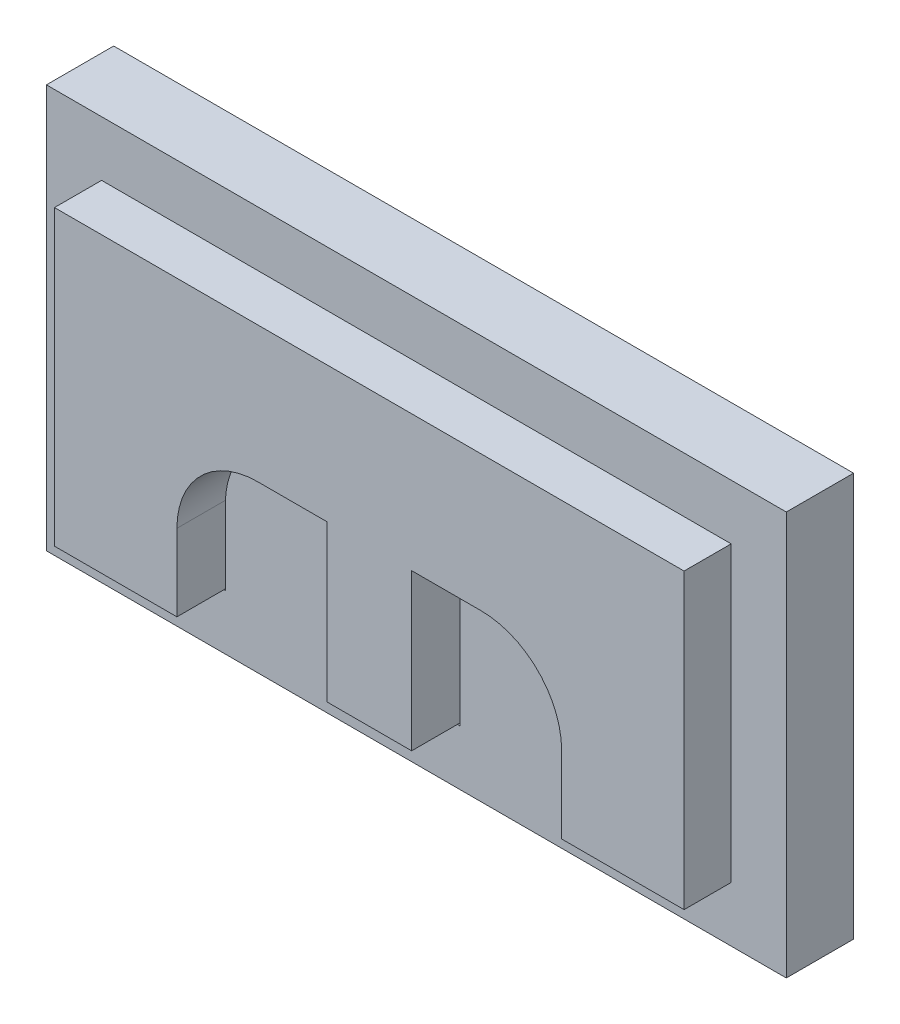
ISO-10303-21;
HEADER;
FILE_DESCRIPTION(('STEP AP214'),'2;1');
FILE_NAME('part.step','',(''),(''),'','','');
FILE_SCHEMA(('AUTOMOTIVE_DESIGN { 1 0 10303 214 1 1 1 1 }'));
ENDSEC;
DATA;
#1=APPLICATION_CONTEXT('core data for automotive mechanical design processes');
#2=APPLICATION_PROTOCOL_DEFINITION('international standard','automotive_design',2000,#1);
#3=PRODUCT_CONTEXT('',#1,'mechanical');
#4=PRODUCT('Part','Part','',(#3));
#5=PRODUCT_RELATED_PRODUCT_CATEGORY('part','',(#4));
#6=PRODUCT_DEFINITION_FORMATION('','',#4);
#7=PRODUCT_DEFINITION_CONTEXT('part definition',#1,'design');
#8=PRODUCT_DEFINITION('design','',#6,#7);
#9=PRODUCT_DEFINITION_SHAPE('','',#8);
#10=(LENGTH_UNIT() NAMED_UNIT(*) SI_UNIT(.MILLI.,.METRE.));
#11=(NAMED_UNIT(*) PLANE_ANGLE_UNIT() SI_UNIT($,.RADIAN.));
#12=(NAMED_UNIT(*) SI_UNIT($,.STERADIAN.) SOLID_ANGLE_UNIT());
#13=UNCERTAINTY_MEASURE_WITH_UNIT(LENGTH_MEASURE(1.E-05),#10,'distance_accuracy_value','');
#14=(GEOMETRIC_REPRESENTATION_CONTEXT(3) GLOBAL_UNCERTAINTY_ASSIGNED_CONTEXT((#13)) GLOBAL_UNIT_ASSIGNED_CONTEXT((#10,
#11,#12)) REPRESENTATION_CONTEXT('',''));
#15=CARTESIAN_POINT('',(0.,0.,0.));
#16=DIRECTION('',(0.,0.,1.));
#17=DIRECTION('',(1.,0.,0.));
#18=AXIS2_PLACEMENT_3D('',#15,#16,#17);
#19=CARTESIAN_POINT('',(0.,0.,10.));
#20=DIRECTION('',(0.,0.,-1.));
#21=DIRECTION('',(-1.,0.,0.));
#22=AXIS2_PLACEMENT_3D('',#19,#20,#21);
#23=PLANE('',#22);
#24=DIRECTION('',(0.,-1.,0.));
#25=VECTOR('',#24,1.);
#26=CARTESIAN_POINT('',(0.,0.,10.));
#27=LINE('',#26,#25);
#28=CARTESIAN_POINT('',(0.,60.,10.));
#29=VERTEX_POINT('',#28);
#30=CARTESIAN_POINT('',(0.,0.,10.));
#31=VERTEX_POINT('',#30);
#32=EDGE_CURVE('E417',#29,#31,#27,.T.);
#33=ORIENTED_EDGE('',*,*,#32,.T.);
#34=DIRECTION('',(1.,0.,0.));
#35=VECTOR('',#34,1.);
#36=CARTESIAN_POINT('',(0.,0.,10.));
#37=LINE('',#36,#35);
#38=CARTESIAN_POINT('',(110.,0.,10.));
#39=VERTEX_POINT('',#38);
#40=EDGE_CURVE('E420',#31,#39,#37,.T.);
#41=ORIENTED_EDGE('',*,*,#40,.T.);
#42=DIRECTION('',(0.,1.,0.));
#43=VECTOR('',#42,1.);
#44=CARTESIAN_POINT('',(110.,0.,10.));
#45=LINE('',#44,#43);
#46=CARTESIAN_POINT('',(110.,60.,10.));
#47=VERTEX_POINT('',#46);
#48=EDGE_CURVE('E423',#39,#47,#45,.T.);
#49=ORIENTED_EDGE('',*,*,#48,.T.);
#50=DIRECTION('',(-1.,0.,0.));
#51=VECTOR('',#50,1.);
#52=CARTESIAN_POINT('',(0.,60.,10.));
#53=LINE('',#52,#51);
#54=EDGE_CURVE('E425',#47,#29,#53,.T.);
#55=ORIENTED_EDGE('',*,*,#54,.T.);
#56=EDGE_LOOP('',(#33,#41,#49,#55));
#57=FACE_BOUND('',#56,.T.);
#58=DIRECTION('',(1.,0.,0.));
#59=VECTOR('',#58,1.);
#60=CARTESIAN_POINT('',(0.,31.4,10.));
#61=LINE('',#60,#59);
#62=CARTESIAN_POINT('',(38.6,31.4,10.));
#63=VERTEX_POINT('',#62);
#64=CARTESIAN_POINT('',(48.5,31.4,10.));
#65=VERTEX_POINT('',#64);
#66=EDGE_CURVE('E250',#63,#65,#61,.T.);
#67=ORIENTED_EDGE('',*,*,#66,.F.);
#68=CARTESIAN_POINT('',(38.6,19.4,10.));
#69=DIRECTION('',(0.,0.,-1.));
#70=DIRECTION('',(-1.,0.,0.));
#71=AXIS2_PLACEMENT_3D('',#68,#69,#70);
#72=CIRCLE('',#71,12.);
#73=CARTESIAN_POINT('',(26.6,19.4,10.));
#74=VERTEX_POINT('',#73);
#75=EDGE_CURVE('E11',#74,#63,#72,.T.);
#76=ORIENTED_EDGE('',*,*,#75,.F.);
#77=DIRECTION('',(0.,1.,0.));
#78=VECTOR('',#77,1.);
#79=CARTESIAN_POINT('',(26.6,0.,10.));
#80=LINE('',#79,#78);
#81=CARTESIAN_POINT('',(26.6,8.2,10.));
#82=VERTEX_POINT('',#81);
#83=EDGE_CURVE('E49',#82,#74,#80,.T.);
#84=ORIENTED_EDGE('',*,*,#83,.F.);
#85=DIRECTION('',(-1.,0.,0.));
#86=VECTOR('',#85,1.);
#87=CARTESIAN_POINT('',(0.,8.2,10.));
#88=LINE('',#87,#86);
#89=CARTESIAN_POINT('',(26.4,8.2,10.));
#90=VERTEX_POINT('',#89);
#91=EDGE_CURVE('E296',#82,#90,#88,.T.);
#92=ORIENTED_EDGE('',*,*,#91,.T.);
#93=DIRECTION('',(1.,0.,0.));
#94=VECTOR('',#93,1.);
#95=CARTESIAN_POINT('',(8.2,8.2,10.));
#96=LINE('',#95,#94);
#97=CARTESIAN_POINT('',(8.2,8.2,10.));
#98=VERTEX_POINT('',#97);
#99=EDGE_CURVE('E396',#98,#90,#96,.T.);
#100=ORIENTED_EDGE('',*,*,#99,.F.);
#101=DIRECTION('',(0.,-1.,0.));
#102=VECTOR('',#101,1.);
#103=CARTESIAN_POINT('',(8.2,51.8,10.));
#104=LINE('',#103,#102);
#105=CARTESIAN_POINT('',(8.2,51.8,10.));
#106=VERTEX_POINT('',#105);
#107=EDGE_CURVE('E379',#106,#98,#104,.T.);
#108=ORIENTED_EDGE('',*,*,#107,.F.);
#109=DIRECTION('',(-1.,0.,0.));
#110=VECTOR('',#109,1.);
#111=CARTESIAN_POINT('',(8.2,51.8,10.));
#112=LINE('',#111,#110);
#113=CARTESIAN_POINT('',(101.8,51.8,10.));
#114=VERTEX_POINT('',#113);
#115=EDGE_CURVE('E384',#114,#106,#112,.T.);
#116=ORIENTED_EDGE('',*,*,#115,.F.);
#117=DIRECTION('',(0.,1.,0.));
#118=VECTOR('',#117,1.);
#119=CARTESIAN_POINT('',(101.8,51.8,10.));
#120=LINE('',#119,#118);
#121=CARTESIAN_POINT('',(101.8,8.2,10.));
#122=VERTEX_POINT('',#121);
#123=EDGE_CURVE('E399',#122,#114,#120,.T.);
#124=ORIENTED_EDGE('',*,*,#123,.F.);
#125=CARTESIAN_POINT('',(83.6,8.2,10.));
#126=VERTEX_POINT('',#125);
#127=EDGE_CURVE('E395',#126,#122,#96,.T.);
#128=ORIENTED_EDGE('',*,*,#127,.F.);
#129=DIRECTION('',(1.,0.,0.));
#130=VECTOR('',#129,1.);
#131=CARTESIAN_POINT('',(0.,8.2,10.));
#132=LINE('',#131,#130);
#133=CARTESIAN_POINT('',(83.4,8.2,10.));
#134=VERTEX_POINT('',#133);
#135=EDGE_CURVE('E358',#134,#126,#132,.T.);
#136=ORIENTED_EDGE('',*,*,#135,.F.);
#137=DIRECTION('',(0.,1.,0.));
#138=VECTOR('',#137,1.);
#139=CARTESIAN_POINT('',(83.4,1.03339955640333E-13,10.));
#140=LINE('',#139,#138);
#141=CARTESIAN_POINT('',(83.4,19.4,10.));
#142=VERTEX_POINT('',#141);
#143=EDGE_CURVE('E461',#134,#142,#140,.T.);
#144=ORIENTED_EDGE('',*,*,#143,.T.);
#145=CARTESIAN_POINT('',(71.4,19.4,10.));
#146=DIRECTION('',(0.,0.,-1.));
#147=DIRECTION('',(-1.,0.,0.));
#148=AXIS2_PLACEMENT_3D('',#145,#146,#147);
#149=CIRCLE('',#148,12.);
#150=CARTESIAN_POINT('',(71.4,31.4,10.));
#151=VERTEX_POINT('',#150);
#152=EDGE_CURVE('E458',#142,#151,#149,.F.);
#153=ORIENTED_EDGE('',*,*,#152,.T.);
#154=DIRECTION('',(-1.,0.,0.));
#155=VECTOR('',#154,1.);
#156=CARTESIAN_POINT('',(0.,31.4,10.));
#157=LINE('',#156,#155);
#158=CARTESIAN_POINT('',(61.5,31.4,10.));
#159=VERTEX_POINT('',#158);
#160=EDGE_CURVE('E336',#151,#159,#157,.T.);
#161=ORIENTED_EDGE('',*,*,#160,.T.);
#162=DIRECTION('',(0.,1.,0.));
#163=VECTOR('',#162,1.);
#164=CARTESIAN_POINT('',(61.5,31.6,10.));
#165=LINE('',#164,#163);
#166=CARTESIAN_POINT('',(61.5,8.2,10.));
#167=VERTEX_POINT('',#166);
#168=EDGE_CURVE('E361',#167,#159,#165,.T.);
#169=ORIENTED_EDGE('',*,*,#168,.F.);
#170=CARTESIAN_POINT('',(48.5,8.2,10.));
#171=VERTEX_POINT('',#170);
#172=EDGE_CURVE('E400',#171,#167,#96,.T.);
#173=ORIENTED_EDGE('',*,*,#172,.F.);
#174=DIRECTION('',(0.,1.,0.));
#175=VECTOR('',#174,1.);
#176=CARTESIAN_POINT('',(48.5,31.6,10.));
#177=LINE('',#176,#175);
#178=EDGE_CURVE('E370',#171,#65,#177,.T.);
#179=ORIENTED_EDGE('',*,*,#178,.T.);
#180=EDGE_LOOP('',(#67,#76,#84,#92,#100,#108,#116,#124,#128,#136,#144,#153,#161,#169,#173,#179));
#181=FACE_BOUND('',#180,.T.);
#182=ADVANCED_FACE('F41',(#57,#181),#23,.F.);
#183=CARTESIAN_POINT('',(8.2,8.2,17.));
#184=DIRECTION('',(0.,1.,0.));
#185=DIRECTION('',(0.,0.,1.));
#186=AXIS2_PLACEMENT_3D('',#183,#184,#185);
#187=PLANE('',#186);
#188=DIRECTION('',(0.,0.,1.));
#189=VECTOR('',#188,1.);
#190=CARTESIAN_POINT('',(83.6,8.2,10.));
#191=LINE('',#190,#189);
#192=CARTESIAN_POINT('',(83.6,8.2,17.));
#193=VERTEX_POINT('',#192);
#194=EDGE_CURVE('E363',#126,#193,#191,.T.);
#195=ORIENTED_EDGE('',*,*,#194,.F.);
#196=ORIENTED_EDGE('',*,*,#127,.T.);
#197=DIRECTION('',(0.,0.,-1.));
#198=VECTOR('',#197,1.);
#199=CARTESIAN_POINT('',(101.8,8.2,17.));
#200=LINE('',#199,#198);
#201=CARTESIAN_POINT('',(101.8,8.2,17.));
#202=VERTEX_POINT('',#201);
#203=EDGE_CURVE('E410',#202,#122,#200,.T.);
#204=ORIENTED_EDGE('',*,*,#203,.F.);
#205=DIRECTION('',(1.,0.,0.));
#206=VECTOR('',#205,1.);
#207=CARTESIAN_POINT('',(8.2,8.2,17.));
#208=LINE('',#207,#206);
#209=EDGE_CURVE('E383',#193,#202,#208,.T.);
#210=ORIENTED_EDGE('',*,*,#209,.F.);
#211=EDGE_LOOP('',(#195,#196,#204,#210));
#212=FACE_BOUND('',#211,.T.);
#213=ADVANCED_FACE('F499',(#212),#187,.F.);
#214=CARTESIAN_POINT('',(0.,0.,17.));
#215=DIRECTION('',(0.,0.,1.));
#216=DIRECTION('',(1.,0.,0.));
#217=AXIS2_PLACEMENT_3D('',#214,#215,#216);
#218=PLANE('',#217);
#219=DIRECTION('',(-1.,0.,0.));
#220=VECTOR('',#219,1.);
#221=CARTESIAN_POINT('',(26.4,31.6,17.));
#222=LINE('',#221,#220);
#223=CARTESIAN_POINT('',(48.7,31.6,17.));
#224=VERTEX_POINT('',#223);
#225=CARTESIAN_POINT('',(38.4,31.6,17.));
#226=VERTEX_POINT('',#225);
#227=EDGE_CURVE('E373',#224,#226,#222,.T.);
#228=ORIENTED_EDGE('',*,*,#227,.F.);
#229=DIRECTION('',(0.,-1.,0.));
#230=VECTOR('',#229,1.);
#231=CARTESIAN_POINT('',(48.7,0.,17.));
#232=LINE('',#231,#230);
#233=CARTESIAN_POINT('',(48.7,8.4,17.));
#234=VERTEX_POINT('',#233);
#235=EDGE_CURVE('E256',#224,#234,#232,.T.);
#236=ORIENTED_EDGE('',*,*,#235,.T.);
#237=DIRECTION('',(-1.,0.,0.));
#238=VECTOR('',#237,1.);
#239=CARTESIAN_POINT('',(0.,8.39999999999998,17.));
#240=LINE('',#239,#238);
#241=CARTESIAN_POINT('',(61.3,8.4,17.));
#242=VERTEX_POINT('',#241);
#243=EDGE_CURVE('E303',#242,#234,#240,.T.);
#244=ORIENTED_EDGE('',*,*,#243,.F.);
#245=DIRECTION('',(0.,-1.,0.));
#246=VECTOR('',#245,1.);
#247=CARTESIAN_POINT('',(61.3,0.,17.));
#248=LINE('',#247,#246);
#249=CARTESIAN_POINT('',(61.3,31.6,17.));
#250=VERTEX_POINT('',#249);
#251=EDGE_CURVE('E299',#250,#242,#248,.T.);
#252=ORIENTED_EDGE('',*,*,#251,.F.);
#253=DIRECTION('',(1.,0.,0.));
#254=VECTOR('',#253,1.);
#255=CARTESIAN_POINT('',(83.6,31.6,17.));
#256=LINE('',#255,#254);
#257=CARTESIAN_POINT('',(71.6,31.6,17.));
#258=VERTEX_POINT('',#257);
#259=EDGE_CURVE('E364',#250,#258,#256,.T.);
#260=ORIENTED_EDGE('',*,*,#259,.T.);
#261=CARTESIAN_POINT('',(71.6,19.6,17.));
#262=DIRECTION('',(0.,0.,1.));
#263=DIRECTION('',(1.,0.,0.));
#264=AXIS2_PLACEMENT_3D('',#261,#262,#263);
#265=CIRCLE('',#264,12.);
#266=CARTESIAN_POINT('',(83.6,19.6,17.));
#267=VERTEX_POINT('',#266);
#268=EDGE_CURVE('E56',#258,#267,#265,.F.);
#269=ORIENTED_EDGE('',*,*,#268,.T.);
#270=DIRECTION('',(0.,-1.,0.));
#271=VECTOR('',#270,1.);
#272=CARTESIAN_POINT('',(83.6,31.6,17.));
#273=LINE('',#272,#271);
#274=EDGE_CURVE('E360',#267,#193,#273,.T.);
#275=ORIENTED_EDGE('',*,*,#274,.T.);
#276=ORIENTED_EDGE('',*,*,#209,.T.);
#277=DIRECTION('',(0.,1.,0.));
#278=VECTOR('',#277,1.);
#279=CARTESIAN_POINT('',(101.8,51.8,17.));
#280=LINE('',#279,#278);
#281=CARTESIAN_POINT('',(101.8,51.8,17.));
#282=VERTEX_POINT('',#281);
#283=EDGE_CURVE('E388',#202,#282,#280,.T.);
#284=ORIENTED_EDGE('',*,*,#283,.T.);
#285=DIRECTION('',(-1.,0.,0.));
#286=VECTOR('',#285,1.);
#287=CARTESIAN_POINT('',(8.2,51.8,17.));
#288=LINE('',#287,#286);
#289=CARTESIAN_POINT('',(8.2,51.8,17.));
#290=VERTEX_POINT('',#289);
#291=EDGE_CURVE('E390',#282,#290,#288,.T.);
#292=ORIENTED_EDGE('',*,*,#291,.T.);
#293=DIRECTION('',(0.,-1.,0.));
#294=VECTOR('',#293,1.);
#295=CARTESIAN_POINT('',(8.2,51.8,17.));
#296=LINE('',#295,#294);
#297=CARTESIAN_POINT('',(8.2,8.2,17.));
#298=VERTEX_POINT('',#297);
#299=EDGE_CURVE('E380',#290,#298,#296,.T.);
#300=ORIENTED_EDGE('',*,*,#299,.T.);
#301=CARTESIAN_POINT('',(26.4,8.2,17.));
#302=VERTEX_POINT('',#301);
#303=EDGE_CURVE('E385',#298,#302,#208,.T.);
#304=ORIENTED_EDGE('',*,*,#303,.T.);
#305=DIRECTION('',(0.,-1.,0.));
#306=VECTOR('',#305,1.);
#307=CARTESIAN_POINT('',(26.4,31.6,17.));
#308=LINE('',#307,#306);
#309=CARTESIAN_POINT('',(26.4,19.6,17.));
#310=VERTEX_POINT('',#309);
#311=EDGE_CURVE('E369',#310,#302,#308,.T.);
#312=ORIENTED_EDGE('',*,*,#311,.F.);
#313=CARTESIAN_POINT('',(38.4,19.6,17.));
#314=DIRECTION('',(0.,0.,1.));
#315=DIRECTION('',(1.,0.,0.));
#316=AXIS2_PLACEMENT_3D('',#313,#314,#315);
#317=CIRCLE('',#316,12.);
#318=EDGE_CURVE('E451',#310,#226,#317,.F.);
#319=ORIENTED_EDGE('',*,*,#318,.T.);
#320=EDGE_LOOP('',(#228,#236,#244,#252,#260,#269,#275,#276,#284,#292,#300,#304,#312,#319));
#321=FACE_BOUND('',#320,.T.);
#322=ADVANCED_FACE('F514',(#321),#218,.T.);
#323=ORIENTED_EDGE('',*,*,#99,.T.);
#324=DIRECTION('',(0.,0.,1.));
#325=VECTOR('',#324,1.);
#326=CARTESIAN_POINT('',(26.4,8.2,10.));
#327=LINE('',#326,#325);
#328=EDGE_CURVE('E372',#90,#302,#327,.T.);
#329=ORIENTED_EDGE('',*,*,#328,.T.);
#330=ORIENTED_EDGE('',*,*,#303,.F.);
#331=DIRECTION('',(0.,0.,-1.));
#332=VECTOR('',#331,1.);
#333=CARTESIAN_POINT('',(8.2,8.2,17.));
#334=LINE('',#333,#332);
#335=EDGE_CURVE('E413',#298,#98,#334,.T.);
#336=ORIENTED_EDGE('',*,*,#335,.T.);
#337=EDGE_LOOP('',(#323,#329,#330,#336));
#338=FACE_BOUND('',#337,.T.);
#339=ADVANCED_FACE('F540',(#338),#187,.F.);
#340=CARTESIAN_POINT('',(0.,0.,10.));
#341=DIRECTION('',(1.,0.,0.));
#342=DIRECTION('',(0.,0.,-1.));
#343=AXIS2_PLACEMENT_3D('',#340,#341,#342);
#344=PLANE('',#343);
#345=DIRECTION('',(0.,-1.,0.));
#346=VECTOR('',#345,1.);
#347=CARTESIAN_POINT('',(0.,0.,0.));
#348=LINE('',#347,#346);
#349=CARTESIAN_POINT('',(0.,60.,0.));
#350=VERTEX_POINT('',#349);
#351=CARTESIAN_POINT('',(0.,0.,0.));
#352=VERTEX_POINT('',#351);
#353=EDGE_CURVE('E416',#350,#352,#348,.T.);
#354=ORIENTED_EDGE('',*,*,#353,.T.);
#355=DIRECTION('',(0.,0.,-1.));
#356=VECTOR('',#355,1.);
#357=CARTESIAN_POINT('',(0.,0.,10.));
#358=LINE('',#357,#356);
#359=EDGE_CURVE('E443',#31,#352,#358,.T.);
#360=ORIENTED_EDGE('',*,*,#359,.F.);
#361=ORIENTED_EDGE('',*,*,#32,.F.);
#362=DIRECTION('',(0.,0.,-1.));
#363=VECTOR('',#362,1.);
#364=CARTESIAN_POINT('',(0.,60.,10.));
#365=LINE('',#364,#363);
#366=EDGE_CURVE('E427',#29,#350,#365,.T.);
#367=ORIENTED_EDGE('',*,*,#366,.T.);
#368=EDGE_LOOP('',(#354,#360,#361,#367));
#369=FACE_BOUND('',#368,.T.);
#370=ADVANCED_FACE('F584',(#369),#344,.F.);
#371=CARTESIAN_POINT('',(0.,0.,10.));
#372=DIRECTION('',(0.,1.,0.));
#373=DIRECTION('',(0.,0.,1.));
#374=AXIS2_PLACEMENT_3D('',#371,#372,#373);
#375=PLANE('',#374);
#376=DIRECTION('',(1.,0.,0.));
#377=VECTOR('',#376,1.);
#378=CARTESIAN_POINT('',(0.,0.,0.));
#379=LINE('',#378,#377);
#380=CARTESIAN_POINT('',(110.,0.,0.));
#381=VERTEX_POINT('',#380);
#382=EDGE_CURVE('E430',#352,#381,#379,.T.);
#383=ORIENTED_EDGE('',*,*,#382,.T.);
#384=DIRECTION('',(0.,0.,-1.));
#385=VECTOR('',#384,1.);
#386=CARTESIAN_POINT('',(110.,0.,10.));
#387=LINE('',#386,#385);
#388=EDGE_CURVE('E440',#39,#381,#387,.T.);
#389=ORIENTED_EDGE('',*,*,#388,.F.);
#390=ORIENTED_EDGE('',*,*,#40,.F.);
#391=ORIENTED_EDGE('',*,*,#359,.T.);
#392=EDGE_LOOP('',(#383,#389,#390,#391));
#393=FACE_BOUND('',#392,.T.);
#394=ADVANCED_FACE('F580',(#393),#375,.F.);
#395=CARTESIAN_POINT('',(110.,0.,10.));
#396=DIRECTION('',(-1.,0.,0.));
#397=DIRECTION('',(0.,0.,1.));
#398=AXIS2_PLACEMENT_3D('',#395,#396,#397);
#399=PLANE('',#398);
#400=DIRECTION('',(0.,1.,0.));
#401=VECTOR('',#400,1.);
#402=CARTESIAN_POINT('',(110.,0.,0.));
#403=LINE('',#402,#401);
#404=CARTESIAN_POINT('',(110.,60.,0.));
#405=VERTEX_POINT('',#404);
#406=EDGE_CURVE('E432',#381,#405,#403,.T.);
#407=ORIENTED_EDGE('',*,*,#406,.T.);
#408=DIRECTION('',(0.,0.,-1.));
#409=VECTOR('',#408,1.);
#410=CARTESIAN_POINT('',(110.,60.,10.));
#411=LINE('',#410,#409);
#412=EDGE_CURVE('E437',#47,#405,#411,.T.);
#413=ORIENTED_EDGE('',*,*,#412,.F.);
#414=ORIENTED_EDGE('',*,*,#48,.F.);
#415=ORIENTED_EDGE('',*,*,#388,.T.);
#416=EDGE_LOOP('',(#407,#413,#414,#415));
#417=FACE_BOUND('',#416,.T.);
#418=ADVANCED_FACE('F576',(#417),#399,.F.);
#419=CARTESIAN_POINT('',(0.,60.,10.));
#420=DIRECTION('',(0.,-1.,0.));
#421=DIRECTION('',(0.,0.,-1.));
#422=AXIS2_PLACEMENT_3D('',#419,#420,#421);
#423=PLANE('',#422);
#424=DIRECTION('',(-1.,0.,0.));
#425=VECTOR('',#424,1.);
#426=CARTESIAN_POINT('',(0.,60.,0.));
#427=LINE('',#426,#425);
#428=EDGE_CURVE('E421',#405,#350,#427,.T.);
#429=ORIENTED_EDGE('',*,*,#428,.T.);
#430=ORIENTED_EDGE('',*,*,#366,.F.);
#431=ORIENTED_EDGE('',*,*,#54,.F.);
#432=ORIENTED_EDGE('',*,*,#412,.T.);
#433=EDGE_LOOP('',(#429,#430,#431,#432));
#434=FACE_BOUND('',#433,.T.);
#435=ADVANCED_FACE('F572',(#434),#423,.F.);
#436=CARTESIAN_POINT('',(0.,0.,0.));
#437=DIRECTION('',(0.,0.,-1.));
#438=DIRECTION('',(-1.,0.,0.));
#439=AXIS2_PLACEMENT_3D('',#436,#437,#438);
#440=PLANE('',#439);
#441=ORIENTED_EDGE('',*,*,#353,.F.);
#442=ORIENTED_EDGE('',*,*,#428,.F.);
#443=ORIENTED_EDGE('',*,*,#406,.F.);
#444=ORIENTED_EDGE('',*,*,#382,.F.);
#445=EDGE_LOOP('',(#441,#442,#443,#444));
#446=FACE_BOUND('',#445,.T.);
#447=ADVANCED_FACE('F558',(#446),#440,.T.);
#448=CARTESIAN_POINT('',(8.2,51.8,17.));
#449=DIRECTION('',(1.,0.,0.));
#450=DIRECTION('',(0.,1.,0.));
#451=AXIS2_PLACEMENT_3D('',#448,#449,#450);
#452=PLANE('',#451);
#453=ORIENTED_EDGE('',*,*,#107,.T.);
#454=ORIENTED_EDGE('',*,*,#335,.F.);
#455=ORIENTED_EDGE('',*,*,#299,.F.);
#456=DIRECTION('',(0.,0.,-1.));
#457=VECTOR('',#456,1.);
#458=CARTESIAN_POINT('',(8.2,51.8,17.));
#459=LINE('',#458,#457);
#460=EDGE_CURVE('E392',#290,#106,#459,.T.);
#461=ORIENTED_EDGE('',*,*,#460,.T.);
#462=EDGE_LOOP('',(#453,#454,#455,#461));
#463=FACE_BOUND('',#462,.T.);
#464=ADVANCED_FACE('F543',(#463),#452,.F.);
#465=CARTESIAN_POINT('',(101.8,51.8,17.));
#466=DIRECTION('',(-1.,0.,0.));
#467=DIRECTION('',(0.,0.,1.));
#468=AXIS2_PLACEMENT_3D('',#465,#466,#467);
#469=PLANE('',#468);
#470=ORIENTED_EDGE('',*,*,#123,.T.);
#471=DIRECTION('',(0.,0.,-1.));
#472=VECTOR('',#471,1.);
#473=CARTESIAN_POINT('',(101.8,51.8,17.));
#474=LINE('',#473,#472);
#475=EDGE_CURVE('E407',#282,#114,#474,.T.);
#476=ORIENTED_EDGE('',*,*,#475,.F.);
#477=ORIENTED_EDGE('',*,*,#283,.F.);
#478=ORIENTED_EDGE('',*,*,#203,.T.);
#479=EDGE_LOOP('',(#470,#476,#477,#478));
#480=FACE_BOUND('',#479,.T.);
#481=ADVANCED_FACE('F550',(#480),#469,.F.);
#482=CARTESIAN_POINT('',(8.2,51.8,17.));
#483=DIRECTION('',(0.,-1.,0.));
#484=DIRECTION('',(0.,0.,-1.));
#485=AXIS2_PLACEMENT_3D('',#482,#483,#484);
#486=PLANE('',#485);
#487=ORIENTED_EDGE('',*,*,#115,.T.);
#488=ORIENTED_EDGE('',*,*,#460,.F.);
#489=ORIENTED_EDGE('',*,*,#291,.F.);
#490=ORIENTED_EDGE('',*,*,#475,.T.);
#491=EDGE_LOOP('',(#487,#488,#489,#490));
#492=FACE_BOUND('',#491,.T.);
#493=ADVANCED_FACE('F547',(#492),#486,.F.);
#494=CARTESIAN_POINT('',(26.4,31.6,10.));
#495=DIRECTION('',(-1.,0.,0.));
#496=DIRECTION('',(0.,0.,1.));
#497=AXIS2_PLACEMENT_3D('',#494,#495,#496);
#498=PLANE('',#497);
#499=ORIENTED_EDGE('',*,*,#328,.F.);
#500=DIRECTION('',(0.,0.,1.));
#501=VECTOR('',#500,1.);
#502=CARTESIAN_POINT('',(26.4,8.2,7.));
#503=LINE('',#502,#501);
#504=CARTESIAN_POINT('',(26.4,8.2,7.));
#505=VERTEX_POINT('',#504);
#506=EDGE_CURVE('E286',#505,#90,#503,.T.);
#507=ORIENTED_EDGE('',*,*,#506,.F.);
#508=DIRECTION('',(0.,-1.,0.));
#509=VECTOR('',#508,1.);
#510=CARTESIAN_POINT('',(26.4,0.,7.));
#511=LINE('',#510,#509);
#512=CARTESIAN_POINT('',(26.4,19.6,7.));
#513=VERTEX_POINT('',#512);
#514=EDGE_CURVE('E269',#513,#505,#511,.T.);
#515=ORIENTED_EDGE('',*,*,#514,.F.);
#516=DIRECTION('',(0.,0.,1.));
#517=VECTOR('',#516,1.);
#518=CARTESIAN_POINT('',(26.4,19.6,17.));
#519=LINE('',#518,#517);
#520=EDGE_CURVE('E446',#513,#310,#519,.T.);
#521=ORIENTED_EDGE('',*,*,#520,.T.);
#522=ORIENTED_EDGE('',*,*,#311,.T.);
#523=EDGE_LOOP('',(#499,#507,#515,#521,#522));
#524=FACE_BOUND('',#523,.T.);
#525=ADVANCED_FACE('F534',(#524),#498,.F.);
#526=CARTESIAN_POINT('',(26.4,31.6,10.));
#527=DIRECTION('',(0.,1.,0.));
#528=DIRECTION('',(0.,0.,1.));
#529=AXIS2_PLACEMENT_3D('',#526,#527,#528);
#530=PLANE('',#529);
#531=DIRECTION('',(0.,0.,1.));
#532=VECTOR('',#531,1.);
#533=CARTESIAN_POINT('',(38.4,31.6,10.));
#534=LINE('',#533,#532);
#535=CARTESIAN_POINT('',(38.4,31.6,7.));
#536=VERTEX_POINT('',#535);
#537=EDGE_CURVE('E449',#226,#536,#534,.F.);
#538=ORIENTED_EDGE('',*,*,#537,.T.);
#539=DIRECTION('',(-1.,0.,0.));
#540=VECTOR('',#539,1.);
#541=CARTESIAN_POINT('',(110.,31.6,7.));
#542=LINE('',#541,#540);
#543=CARTESIAN_POINT('',(48.7,31.6,7.));
#544=VERTEX_POINT('',#543);
#545=EDGE_CURVE('E263',#544,#536,#542,.T.);
#546=ORIENTED_EDGE('',*,*,#545,.F.);
#547=DIRECTION('',(0.,0.,1.));
#548=VECTOR('',#547,1.);
#549=CARTESIAN_POINT('',(48.7,31.6,7.));
#550=LINE('',#549,#548);
#551=EDGE_CURVE('E288',#544,#224,#550,.T.);
#552=ORIENTED_EDGE('',*,*,#551,.T.);
#553=ORIENTED_EDGE('',*,*,#227,.T.);
#554=EDGE_LOOP('',(#538,#546,#552,#553));
#555=FACE_BOUND('',#554,.T.);
#556=ADVANCED_FACE('F525',(#555),#530,.F.);
#557=CARTESIAN_POINT('',(38.4,19.6,10.));
#558=DIRECTION('',(0.,0.,-1.));
#559=DIRECTION('',(-1.,0.,0.));
#560=AXIS2_PLACEMENT_3D('',#557,#558,#559);
#561=CYLINDRICAL_SURFACE('',#560,12.);
#562=ORIENTED_EDGE('',*,*,#520,.F.);
#563=CARTESIAN_POINT('',(38.4,19.6,7.));
#564=DIRECTION('',(0.,0.,-1.));
#565=DIRECTION('',(-1.,0.,0.));
#566=AXIS2_PLACEMENT_3D('',#563,#564,#565);
#567=CIRCLE('',#566,12.);
#568=EDGE_CURVE('E266',#536,#513,#567,.F.);
#569=ORIENTED_EDGE('',*,*,#568,.F.);
#570=ORIENTED_EDGE('',*,*,#537,.F.);
#571=ORIENTED_EDGE('',*,*,#318,.F.);
#572=EDGE_LOOP('',(#562,#569,#570,#571));
#573=FACE_BOUND('',#572,.T.);
#574=ADVANCED_FACE('F529',(#573),#561,.F.);
#575=CARTESIAN_POINT('',(83.6,31.6,10.));
#576=DIRECTION('',(-1.,0.,0.));
#577=DIRECTION('',(0.,0.,1.));
#578=AXIS2_PLACEMENT_3D('',#575,#576,#577);
#579=PLANE('',#578);
#580=ORIENTED_EDGE('',*,*,#274,.F.);
#581=DIRECTION('',(0.,0.,1.));
#582=VECTOR('',#581,1.);
#583=CARTESIAN_POINT('',(83.6,19.6,10.));
#584=LINE('',#583,#582);
#585=CARTESIAN_POINT('',(83.6,19.6,7.));
#586=VERTEX_POINT('',#585);
#587=EDGE_CURVE('E455',#267,#586,#584,.F.);
#588=ORIENTED_EDGE('',*,*,#587,.T.);
#589=DIRECTION('',(0.,-1.,0.));
#590=VECTOR('',#589,1.);
#591=CARTESIAN_POINT('',(83.6,0.,7.));
#592=LINE('',#591,#590);
#593=CARTESIAN_POINT('',(83.6,8.2,7.));
#594=VERTEX_POINT('',#593);
#595=EDGE_CURVE('E311',#586,#594,#592,.T.);
#596=ORIENTED_EDGE('',*,*,#595,.T.);
#597=DIRECTION('',(0.,0.,1.));
#598=VECTOR('',#597,1.);
#599=CARTESIAN_POINT('',(83.6,8.2,7.));
#600=LINE('',#599,#598);
#601=EDGE_CURVE('E345',#594,#126,#600,.T.);
#602=ORIENTED_EDGE('',*,*,#601,.T.);
#603=ORIENTED_EDGE('',*,*,#194,.T.);
#604=EDGE_LOOP('',(#580,#588,#596,#602,#603));
#605=FACE_BOUND('',#604,.T.);
#606=ADVANCED_FACE('F503',(#605),#579,.T.);
#607=CARTESIAN_POINT('',(83.6,31.6,10.));
#608=DIRECTION('',(0.,-1.,0.));
#609=DIRECTION('',(0.,0.,-1.));
#610=AXIS2_PLACEMENT_3D('',#607,#608,#609);
#611=PLANE('',#610);
#612=DIRECTION('',(1.,0.,0.));
#613=VECTOR('',#612,1.);
#614=CARTESIAN_POINT('',(0.,31.6,7.));
#615=LINE('',#614,#613);
#616=CARTESIAN_POINT('',(61.3,31.6,7.));
#617=VERTEX_POINT('',#616);
#618=CARTESIAN_POINT('',(71.6,31.6,7.));
#619=VERTEX_POINT('',#618);
#620=EDGE_CURVE('E316',#617,#619,#615,.T.);
#621=ORIENTED_EDGE('',*,*,#620,.T.);
#622=DIRECTION('',(0.,0.,1.));
#623=VECTOR('',#622,1.);
#624=CARTESIAN_POINT('',(71.6,31.6,17.));
#625=LINE('',#624,#623);
#626=EDGE_CURVE('E453',#619,#258,#625,.T.);
#627=ORIENTED_EDGE('',*,*,#626,.T.);
#628=ORIENTED_EDGE('',*,*,#259,.F.);
#629=DIRECTION('',(0.,0.,1.));
#630=VECTOR('',#629,1.);
#631=CARTESIAN_POINT('',(61.3,31.6,7.));
#632=LINE('',#631,#630);
#633=EDGE_CURVE('E342',#617,#250,#632,.T.);
#634=ORIENTED_EDGE('',*,*,#633,.F.);
#635=EDGE_LOOP('',(#621,#627,#628,#634));
#636=FACE_BOUND('',#635,.T.);
#637=ADVANCED_FACE('F509',(#636),#611,.T.);
#638=CARTESIAN_POINT('',(71.6,19.6,10.));
#639=DIRECTION('',(0.,0.,-1.));
#640=DIRECTION('',(-1.,0.,0.));
#641=AXIS2_PLACEMENT_3D('',#638,#639,#640);
#642=CYLINDRICAL_SURFACE('',#641,12.);
#643=ORIENTED_EDGE('',*,*,#626,.F.);
#644=CARTESIAN_POINT('',(71.6,19.6,7.));
#645=DIRECTION('',(0.,0.,1.));
#646=DIRECTION('',(1.,0.,0.));
#647=AXIS2_PLACEMENT_3D('',#644,#645,#646);
#648=CIRCLE('',#647,12.);
#649=EDGE_CURVE('E313',#619,#586,#648,.F.);
#650=ORIENTED_EDGE('',*,*,#649,.T.);
#651=ORIENTED_EDGE('',*,*,#587,.F.);
#652=ORIENTED_EDGE('',*,*,#268,.F.);
#653=EDGE_LOOP('',(#643,#650,#651,#652));
#654=FACE_BOUND('',#653,.T.);
#655=ADVANCED_FACE('F43',(#654),#642,.F.);
#656=CARTESIAN_POINT('',(61.5,0.,7.));
#657=DIRECTION('',(1.,0.,0.));
#658=DIRECTION('',(0.,0.,-1.));
#659=AXIS2_PLACEMENT_3D('',#656,#657,#658);
#660=PLANE('',#659);
#661=DIRECTION('',(0.,0.,1.));
#662=VECTOR('',#661,1.);
#663=CARTESIAN_POINT('',(61.5,31.4,7.));
#664=LINE('',#663,#662);
#665=CARTESIAN_POINT('',(61.5,31.4,7.));
#666=VERTEX_POINT('',#665);
#667=EDGE_CURVE('E333',#666,#159,#664,.T.);
#668=ORIENTED_EDGE('',*,*,#667,.F.);
#669=DIRECTION('',(0.,1.,0.));
#670=VECTOR('',#669,1.);
#671=CARTESIAN_POINT('',(61.5,0.,7.));
#672=LINE('',#671,#670);
#673=CARTESIAN_POINT('',(61.5,8.2,7.));
#674=VERTEX_POINT('',#673);
#675=EDGE_CURVE('E326',#674,#666,#672,.T.);
#676=ORIENTED_EDGE('',*,*,#675,.F.);
#677=DIRECTION('',(0.,0.,1.));
#678=VECTOR('',#677,1.);
#679=CARTESIAN_POINT('',(61.5,8.2,7.));
#680=LINE('',#679,#678);
#681=EDGE_CURVE('E337',#674,#167,#680,.T.);
#682=ORIENTED_EDGE('',*,*,#681,.T.);
#683=ORIENTED_EDGE('',*,*,#168,.T.);
#684=EDGE_LOOP('',(#668,#676,#682,#683));
#685=FACE_BOUND('',#684,.T.);
#686=ADVANCED_FACE('F478',(#685),#660,.F.);
#687=CARTESIAN_POINT('',(83.4,1.03339955640333E-13,7.));
#688=DIRECTION('',(-1.,0.,0.));
#689=DIRECTION('',(0.,-1.,0.));
#690=AXIS2_PLACEMENT_3D('',#687,#688,#689);
#691=PLANE('',#690);
#692=DIRECTION('',(0.,0.,1.));
#693=VECTOR('',#692,1.);
#694=CARTESIAN_POINT('',(83.4,8.2,7.));
#695=LINE('',#694,#693);
#696=CARTESIAN_POINT('',(83.4,8.2,7.));
#697=VERTEX_POINT('',#696);
#698=EDGE_CURVE('E348',#697,#134,#695,.T.);
#699=ORIENTED_EDGE('',*,*,#698,.F.);
#700=DIRECTION('',(0.,-1.,0.));
#701=VECTOR('',#700,1.);
#702=CARTESIAN_POINT('',(83.4,1.03339955640333E-13,7.));
#703=LINE('',#702,#701);
#704=CARTESIAN_POINT('',(83.4,19.4,7.));
#705=VERTEX_POINT('',#704);
#706=EDGE_CURVE('E306',#705,#697,#703,.T.);
#707=ORIENTED_EDGE('',*,*,#706,.F.);
#708=DIRECTION('',(0.,0.,1.));
#709=VECTOR('',#708,1.);
#710=CARTESIAN_POINT('',(83.4,19.4,7.));
#711=LINE('',#710,#709);
#712=EDGE_CURVE('E351',#705,#142,#711,.T.);
#713=ORIENTED_EDGE('',*,*,#712,.T.);
#714=ORIENTED_EDGE('',*,*,#143,.F.);
#715=EDGE_LOOP('',(#699,#707,#713,#714));
#716=FACE_BOUND('',#715,.T.);
#717=ADVANCED_FACE('F489',(#716),#691,.F.);
#718=CARTESIAN_POINT('',(71.4,19.4,7.));
#719=DIRECTION('',(0.,0.,1.));
#720=DIRECTION('',(1.,0.,0.));
#721=AXIS2_PLACEMENT_3D('',#718,#719,#720);
#722=CYLINDRICAL_SURFACE('',#721,12.);
#723=ORIENTED_EDGE('',*,*,#712,.F.);
#724=CARTESIAN_POINT('',(71.4,19.4,7.));
#725=DIRECTION('',(0.,0.,1.));
#726=DIRECTION('',(1.,0.,0.));
#727=AXIS2_PLACEMENT_3D('',#724,#725,#726);
#728=CIRCLE('',#727,12.);
#729=CARTESIAN_POINT('',(71.4,31.4,7.));
#730=VERTEX_POINT('',#729);
#731=EDGE_CURVE('E302',#730,#705,#728,.F.);
#732=ORIENTED_EDGE('',*,*,#731,.F.);
#733=DIRECTION('',(0.,0.,1.));
#734=VECTOR('',#733,1.);
#735=CARTESIAN_POINT('',(71.4,31.4,7.));
#736=LINE('',#735,#734);
#737=EDGE_CURVE('E329',#730,#151,#736,.T.);
#738=ORIENTED_EDGE('',*,*,#737,.T.);
#739=ORIENTED_EDGE('',*,*,#152,.F.);
#740=EDGE_LOOP('',(#723,#732,#738,#739));
#741=FACE_BOUND('',#740,.T.);
#742=ADVANCED_FACE('F486',(#741),#722,.T.);
#743=CARTESIAN_POINT('',(0.,8.2,7.));
#744=DIRECTION('',(0.,1.,0.));
#745=DIRECTION('',(0.,0.,1.));
#746=AXIS2_PLACEMENT_3D('',#743,#744,#745);
#747=PLANE('',#746);
#748=ORIENTED_EDGE('',*,*,#135,.T.);
#749=ORIENTED_EDGE('',*,*,#601,.F.);
#750=DIRECTION('',(-1.,0.,0.));
#751=VECTOR('',#750,1.);
#752=CARTESIAN_POINT('',(0.,8.2,7.));
#753=LINE('',#752,#751);
#754=EDGE_CURVE('E309',#594,#697,#753,.T.);
#755=ORIENTED_EDGE('',*,*,#754,.T.);
#756=ORIENTED_EDGE('',*,*,#698,.T.);
#757=EDGE_LOOP('',(#748,#749,#755,#756));
#758=FACE_BOUND('',#757,.T.);
#759=ADVANCED_FACE('F492',(#758),#747,.T.);
#760=CARTESIAN_POINT('',(0.,31.4,7.));
#761=DIRECTION('',(0.,-1.,0.));
#762=DIRECTION('',(0.,0.,-1.));
#763=AXIS2_PLACEMENT_3D('',#760,#761,#762);
#764=PLANE('',#763);
#765=ORIENTED_EDGE('',*,*,#737,.F.);
#766=DIRECTION('',(1.,0.,0.));
#767=VECTOR('',#766,1.);
#768=CARTESIAN_POINT('',(0.,31.4,7.));
#769=LINE('',#768,#767);
#770=EDGE_CURVE('E300',#666,#730,#769,.T.);
#771=ORIENTED_EDGE('',*,*,#770,.F.);
#772=ORIENTED_EDGE('',*,*,#667,.T.);
#773=ORIENTED_EDGE('',*,*,#160,.F.);
#774=EDGE_LOOP('',(#765,#771,#772,#773));
#775=FACE_BOUND('',#774,.T.);
#776=ADVANCED_FACE('F481',(#775),#764,.F.);
#777=CARTESIAN_POINT('',(0.,8.2,7.));
#778=DIRECTION('',(0.,-1.,0.));
#779=DIRECTION('',(0.,0.,-1.));
#780=AXIS2_PLACEMENT_3D('',#777,#778,#779);
#781=PLANE('',#780);
#782=ORIENTED_EDGE('',*,*,#681,.F.);
#783=DIRECTION('',(1.,0.,0.));
#784=VECTOR('',#783,1.);
#785=CARTESIAN_POINT('',(0.,8.2,7.));
#786=LINE('',#785,#784);
#787=CARTESIAN_POINT('',(48.5,8.2,7.));
#788=VERTEX_POINT('',#787);
#789=EDGE_CURVE('E324',#788,#674,#786,.T.);
#790=ORIENTED_EDGE('',*,*,#789,.F.);
#791=DIRECTION('',(0.,0.,1.));
#792=VECTOR('',#791,1.);
#793=CARTESIAN_POINT('',(48.5,8.2,7.));
#794=LINE('',#793,#792);
#795=EDGE_CURVE('E237',#788,#171,#794,.T.);
#796=ORIENTED_EDGE('',*,*,#795,.T.);
#797=ORIENTED_EDGE('',*,*,#172,.T.);
#798=EDGE_LOOP('',(#782,#790,#796,#797));
#799=FACE_BOUND('',#798,.T.);
#800=ADVANCED_FACE('F475',(#799),#781,.F.);
#801=CARTESIAN_POINT('',(0.,8.39999999999998,7.));
#802=DIRECTION('',(0.,1.,0.));
#803=DIRECTION('',(-1.,0.,0.));
#804=AXIS2_PLACEMENT_3D('',#801,#802,#803);
#805=PLANE('',#804);
#806=ORIENTED_EDGE('',*,*,#243,.T.);
#807=DIRECTION('',(0.,0.,1.));
#808=VECTOR('',#807,1.);
#809=CARTESIAN_POINT('',(48.7,8.4,7.));
#810=LINE('',#809,#808);
#811=CARTESIAN_POINT('',(48.7,8.4,7.));
#812=VERTEX_POINT('',#811);
#813=EDGE_CURVE('E291',#812,#234,#810,.T.);
#814=ORIENTED_EDGE('',*,*,#813,.F.);
#815=DIRECTION('',(-1.,0.,0.));
#816=VECTOR('',#815,1.);
#817=CARTESIAN_POINT('',(0.,8.39999999999998,7.));
#818=LINE('',#817,#816);
#819=CARTESIAN_POINT('',(61.3,8.4,7.));
#820=VERTEX_POINT('',#819);
#821=EDGE_CURVE('E322',#820,#812,#818,.T.);
#822=ORIENTED_EDGE('',*,*,#821,.F.);
#823=DIRECTION('',(0.,0.,1.));
#824=VECTOR('',#823,1.);
#825=CARTESIAN_POINT('',(61.3,8.4,7.));
#826=LINE('',#825,#824);
#827=EDGE_CURVE('E340',#820,#242,#826,.T.);
#828=ORIENTED_EDGE('',*,*,#827,.T.);
#829=EDGE_LOOP('',(#806,#814,#822,#828));
#830=FACE_BOUND('',#829,.T.);
#831=ADVANCED_FACE('F518',(#830),#805,.F.);
#832=CARTESIAN_POINT('',(61.3,0.,7.));
#833=DIRECTION('',(-1.,0.,0.));
#834=DIRECTION('',(0.,0.,1.));
#835=AXIS2_PLACEMENT_3D('',#832,#833,#834);
#836=PLANE('',#835);
#837=ORIENTED_EDGE('',*,*,#251,.T.);
#838=ORIENTED_EDGE('',*,*,#827,.F.);
#839=DIRECTION('',(0.,-1.,0.));
#840=VECTOR('',#839,1.);
#841=CARTESIAN_POINT('',(61.3,0.,7.));
#842=LINE('',#841,#840);
#843=EDGE_CURVE('E319',#617,#820,#842,.T.);
#844=ORIENTED_EDGE('',*,*,#843,.F.);
#845=ORIENTED_EDGE('',*,*,#633,.T.);
#846=EDGE_LOOP('',(#837,#838,#844,#845));
#847=FACE_BOUND('',#846,.T.);
#848=ADVANCED_FACE('F512',(#847),#836,.F.);
#849=CARTESIAN_POINT('',(0.,0.,7.));
#850=DIRECTION('',(0.,0.,1.));
#851=DIRECTION('',(1.,0.,0.));
#852=AXIS2_PLACEMENT_3D('',#849,#850,#851);
#853=PLANE('',#852);
#854=ORIENTED_EDGE('',*,*,#770,.T.);
#855=ORIENTED_EDGE('',*,*,#731,.T.);
#856=ORIENTED_EDGE('',*,*,#706,.T.);
#857=ORIENTED_EDGE('',*,*,#754,.F.);
#858=ORIENTED_EDGE('',*,*,#595,.F.);
#859=ORIENTED_EDGE('',*,*,#649,.F.);
#860=ORIENTED_EDGE('',*,*,#620,.F.);
#861=ORIENTED_EDGE('',*,*,#843,.T.);
#862=ORIENTED_EDGE('',*,*,#821,.T.);
#863=DIRECTION('',(0.,-1.,0.));
#864=VECTOR('',#863,1.);
#865=CARTESIAN_POINT('',(48.7,0.,7.));
#866=LINE('',#865,#864);
#867=EDGE_CURVE('E241',#544,#812,#866,.T.);
#868=ORIENTED_EDGE('',*,*,#867,.F.);
#869=ORIENTED_EDGE('',*,*,#545,.T.);
#870=ORIENTED_EDGE('',*,*,#568,.T.);
#871=ORIENTED_EDGE('',*,*,#514,.T.);
#872=DIRECTION('',(1.,0.,0.));
#873=VECTOR('',#872,1.);
#874=CARTESIAN_POINT('',(110.,8.2,7.));
#875=LINE('',#874,#873);
#876=CARTESIAN_POINT('',(26.6,8.2,7.));
#877=VERTEX_POINT('',#876);
#878=EDGE_CURVE('E272',#505,#877,#875,.T.);
#879=ORIENTED_EDGE('',*,*,#878,.T.);
#880=DIRECTION('',(0.,-1.,0.));
#881=VECTOR('',#880,1.);
#882=CARTESIAN_POINT('',(26.6,1.03339955640333E-13,7.));
#883=LINE('',#882,#881);
#884=CARTESIAN_POINT('',(26.6,19.4,7.));
#885=VERTEX_POINT('',#884);
#886=EDGE_CURVE('E275',#885,#877,#883,.T.);
#887=ORIENTED_EDGE('',*,*,#886,.F.);
#888=CARTESIAN_POINT('',(38.6,19.4,7.));
#889=DIRECTION('',(0.,0.,-1.));
#890=DIRECTION('',(-1.,0.,0.));
#891=AXIS2_PLACEMENT_3D('',#888,#889,#890);
#892=CIRCLE('',#891,12.);
#893=CARTESIAN_POINT('',(38.6,31.4,7.));
#894=VERTEX_POINT('',#893);
#895=EDGE_CURVE('E251',#894,#885,#892,.F.);
#896=ORIENTED_EDGE('',*,*,#895,.F.);
#897=DIRECTION('',(-1.,0.,0.));
#898=VECTOR('',#897,1.);
#899=CARTESIAN_POINT('',(110.,31.4,7.));
#900=LINE('',#899,#898);
#901=CARTESIAN_POINT('',(48.5,31.4,7.));
#902=VERTEX_POINT('',#901);
#903=EDGE_CURVE('E242',#902,#894,#900,.T.);
#904=ORIENTED_EDGE('',*,*,#903,.F.);
#905=DIRECTION('',(0.,1.,0.));
#906=VECTOR('',#905,1.);
#907=CARTESIAN_POINT('',(48.5,0.,7.));
#908=LINE('',#907,#906);
#909=EDGE_CURVE('E231',#788,#902,#908,.T.);
#910=ORIENTED_EDGE('',*,*,#909,.F.);
#911=ORIENTED_EDGE('',*,*,#789,.T.);
#912=ORIENTED_EDGE('',*,*,#675,.T.);
#913=EDGE_LOOP('',(#854,#855,#856,#857,#858,#859,#860,#861,#862,#868,#869,#870,#871,#879,#887,
#896,#904,#910,#911,#912));
#914=FACE_BOUND('',#913,.T.);
#915=ADVANCED_FACE('F254',(#914),#853,.T.);
#916=CARTESIAN_POINT('',(38.6,19.4,7.));
#917=DIRECTION('',(0.,0.,1.));
#918=DIRECTION('',(1.,0.,0.));
#919=AXIS2_PLACEMENT_3D('',#916,#917,#918);
#920=CYLINDRICAL_SURFACE('',#919,12.);
#921=ORIENTED_EDGE('',*,*,#75,.T.);
#922=DIRECTION('',(0.,0.,1.));
#923=VECTOR('',#922,1.);
#924=CARTESIAN_POINT('',(38.6,31.4,7.));
#925=LINE('',#924,#923);
#926=EDGE_CURVE('E278',#894,#63,#925,.T.);
#927=ORIENTED_EDGE('',*,*,#926,.F.);
#928=ORIENTED_EDGE('',*,*,#895,.T.);
#929=DIRECTION('',(0.,0.,1.));
#930=VECTOR('',#929,1.);
#931=CARTESIAN_POINT('',(26.6,19.4,7.));
#932=LINE('',#931,#930);
#933=EDGE_CURVE('E280',#885,#74,#932,.T.);
#934=ORIENTED_EDGE('',*,*,#933,.T.);
#935=EDGE_LOOP('',(#921,#927,#928,#934));
#936=FACE_BOUND('',#935,.T.);
#937=ADVANCED_FACE('F471',(#936),#920,.T.);
#938=CARTESIAN_POINT('',(26.6,1.03339955640333E-13,7.));
#939=DIRECTION('',(-1.,0.,0.));
#940=DIRECTION('',(0.,-1.,0.));
#941=AXIS2_PLACEMENT_3D('',#938,#939,#940);
#942=PLANE('',#941);
#943=ORIENTED_EDGE('',*,*,#83,.T.);
#944=ORIENTED_EDGE('',*,*,#933,.F.);
#945=ORIENTED_EDGE('',*,*,#886,.T.);
#946=DIRECTION('',(0.,0.,1.));
#947=VECTOR('',#946,1.);
#948=CARTESIAN_POINT('',(26.6,8.2,7.));
#949=LINE('',#948,#947);
#950=EDGE_CURVE('E283',#877,#82,#949,.T.);
#951=ORIENTED_EDGE('',*,*,#950,.T.);
#952=EDGE_LOOP('',(#943,#944,#945,#951));
#953=FACE_BOUND('',#952,.T.);
#954=ADVANCED_FACE('F466',(#953),#942,.T.);
#955=CARTESIAN_POINT('',(48.5,0.,7.));
#956=DIRECTION('',(1.,0.,0.));
#957=DIRECTION('',(0.,0.,-1.));
#958=AXIS2_PLACEMENT_3D('',#955,#956,#957);
#959=PLANE('',#958);
#960=ORIENTED_EDGE('',*,*,#178,.F.);
#961=ORIENTED_EDGE('',*,*,#795,.F.);
#962=ORIENTED_EDGE('',*,*,#909,.T.);
#963=DIRECTION('',(0.,0.,1.));
#964=VECTOR('',#963,1.);
#965=CARTESIAN_POINT('',(48.5,31.4,7.));
#966=LINE('',#965,#964);
#967=EDGE_CURVE('E234',#902,#65,#966,.T.);
#968=ORIENTED_EDGE('',*,*,#967,.T.);
#969=EDGE_LOOP('',(#960,#961,#962,#968));
#970=FACE_BOUND('',#969,.T.);
#971=ADVANCED_FACE('F233',(#970),#959,.T.);
#972=CARTESIAN_POINT('',(110.,8.2,7.));
#973=DIRECTION('',(0.,-1.,0.));
#974=DIRECTION('',(0.,0.,-1.));
#975=AXIS2_PLACEMENT_3D('',#972,#973,#974);
#976=PLANE('',#975);
#977=ORIENTED_EDGE('',*,*,#950,.F.);
#978=ORIENTED_EDGE('',*,*,#878,.F.);
#979=ORIENTED_EDGE('',*,*,#506,.T.);
#980=ORIENTED_EDGE('',*,*,#91,.F.);
#981=EDGE_LOOP('',(#977,#978,#979,#980));
#982=FACE_BOUND('',#981,.T.);
#983=ADVANCED_FACE('F537',(#982),#976,.F.);
#984=CARTESIAN_POINT('',(110.,31.4,7.));
#985=DIRECTION('',(0.,1.,0.));
#986=DIRECTION('',(0.,0.,1.));
#987=AXIS2_PLACEMENT_3D('',#984,#985,#986);
#988=PLANE('',#987);
#989=ORIENTED_EDGE('',*,*,#66,.T.);
#990=ORIENTED_EDGE('',*,*,#967,.F.);
#991=ORIENTED_EDGE('',*,*,#903,.T.);
#992=ORIENTED_EDGE('',*,*,#926,.T.);
#993=EDGE_LOOP('',(#989,#990,#991,#992));
#994=FACE_BOUND('',#993,.T.);
#995=ADVANCED_FACE('F246',(#994),#988,.T.);
#996=CARTESIAN_POINT('',(48.7,0.,7.));
#997=DIRECTION('',(-1.,0.,0.));
#998=DIRECTION('',(0.,0.,1.));
#999=AXIS2_PLACEMENT_3D('',#996,#997,#998);
#1000=PLANE('',#999);
#1001=ORIENTED_EDGE('',*,*,#235,.F.);
#1002=ORIENTED_EDGE('',*,*,#551,.F.);
#1003=ORIENTED_EDGE('',*,*,#867,.T.);
#1004=ORIENTED_EDGE('',*,*,#813,.T.);
#1005=EDGE_LOOP('',(#1001,#1002,#1003,#1004));
#1006=FACE_BOUND('',#1005,.T.);
#1007=ADVANCED_FACE('F521',(#1006),#1000,.T.);
#1008=CLOSED_SHELL('',(#182,#213,#322,#339,#370,#394,#418,#435,#447,#464,#481,#493,#525,#556,
#574,#606,#637,#655,#686,#717,#742,#759,#776,#800,#831,#848,#915,#937,#954,#971,#983,#995,#1007));
#1009=MANIFOLD_SOLID_BREP('B2',#1008);
#1010=ADVANCED_BREP_SHAPE_REPRESENTATION('',(#18,#1009),#14);
#1011=SHAPE_DEFINITION_REPRESENTATION(#9,#1010);
ENDSEC;
END-ISO-10303-21;
